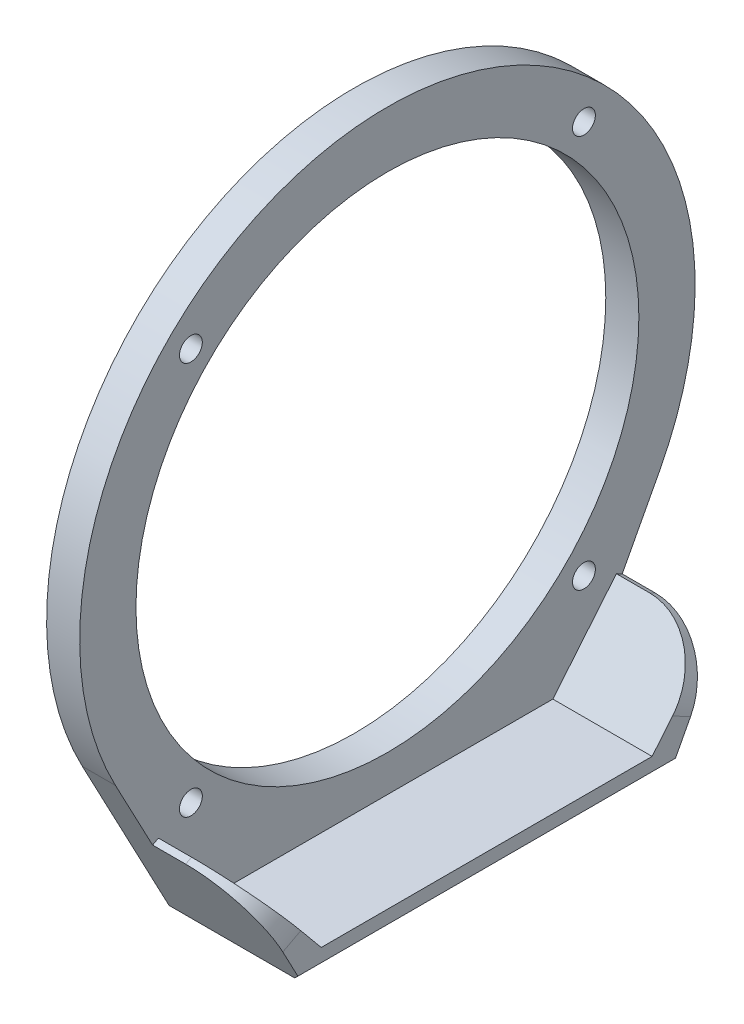
ISO-10303-21;
HEADER;
FILE_DESCRIPTION(('STEP AP214'),'2;1');
FILE_NAME('part.step','',(''),(''),'','','');
FILE_SCHEMA(('AUTOMOTIVE_DESIGN { 1 0 10303 214 1 1 1 1 }'));
ENDSEC;
DATA;
#1=APPLICATION_CONTEXT('core data for automotive mechanical design processes');
#2=APPLICATION_PROTOCOL_DEFINITION('international standard','automotive_design',2000,#1);
#3=PRODUCT_CONTEXT('',#1,'mechanical');
#4=PRODUCT('Part','Part','',(#3));
#5=PRODUCT_RELATED_PRODUCT_CATEGORY('part','',(#4));
#6=PRODUCT_DEFINITION_FORMATION('','',#4);
#7=PRODUCT_DEFINITION_CONTEXT('part definition',#1,'design');
#8=PRODUCT_DEFINITION('design','',#6,#7);
#9=PRODUCT_DEFINITION_SHAPE('','',#8);
#10=(LENGTH_UNIT() NAMED_UNIT(*) SI_UNIT(.MILLI.,.METRE.));
#11=(NAMED_UNIT(*) PLANE_ANGLE_UNIT() SI_UNIT($,.RADIAN.));
#12=(NAMED_UNIT(*) SI_UNIT($,.STERADIAN.) SOLID_ANGLE_UNIT());
#13=UNCERTAINTY_MEASURE_WITH_UNIT(LENGTH_MEASURE(1.E-05),#10,'distance_accuracy_value','');
#14=(GEOMETRIC_REPRESENTATION_CONTEXT(3) GLOBAL_UNCERTAINTY_ASSIGNED_CONTEXT((#13)) GLOBAL_UNIT_ASSIGNED_CONTEXT((#10,
#11,#12)) REPRESENTATION_CONTEXT('',''));
#15=CARTESIAN_POINT('',(0.,0.,0.));
#16=DIRECTION('',(0.,0.,1.));
#17=DIRECTION('',(1.,0.,0.));
#18=AXIS2_PLACEMENT_3D('',#15,#16,#17);
#19=CARTESIAN_POINT('',(5.,0.,0.));
#20=DIRECTION('',(1.,0.,0.));
#21=DIRECTION('',(0.,0.,-1.));
#22=AXIS2_PLACEMENT_3D('',#19,#20,#21);
#23=PLANE('',#22);
#24=CARTESIAN_POINT('',(5.,-29.698484809835,-29.698484809835));
#25=DIRECTION('',(1.,0.,0.));
#26=DIRECTION('',(0.,0.,-1.));
#27=AXIS2_PLACEMENT_3D('',#24,#25,#26);
#28=CIRCLE('',#27,1.7272);
#29=CARTESIAN_POINT('',(5.,-29.698484809835,-31.425684809835));
#30=VERTEX_POINT('',#29);
#31=EDGE_CURVE('E260',#30,#30,#28,.T.);
#32=ORIENTED_EDGE('',*,*,#31,.F.);
#33=EDGE_LOOP('',(#32));
#34=FACE_BOUND('',#33,.T.);
#35=CARTESIAN_POINT('',(5.,29.698484809835,-29.698484809835));
#36=DIRECTION('',(1.,0.,0.));
#37=DIRECTION('',(0.,0.,-1.));
#38=AXIS2_PLACEMENT_3D('',#35,#36,#37);
#39=CIRCLE('',#38,1.7272);
#40=CARTESIAN_POINT('',(5.,29.698484809835,-31.425684809835));
#41=VERTEX_POINT('',#40);
#42=EDGE_CURVE('E218',#41,#41,#39,.T.);
#43=ORIENTED_EDGE('',*,*,#42,.F.);
#44=EDGE_LOOP('',(#43));
#45=FACE_BOUND('',#44,.T.);
#46=CARTESIAN_POINT('',(5.,29.698484809835,29.698484809835));
#47=DIRECTION('',(1.,0.,0.));
#48=DIRECTION('',(0.,0.,-1.));
#49=AXIS2_PLACEMENT_3D('',#46,#47,#48);
#50=CIRCLE('',#49,1.7272);
#51=CARTESIAN_POINT('',(5.,29.698484809835,27.971284809835));
#52=VERTEX_POINT('',#51);
#53=EDGE_CURVE('E253',#52,#52,#50,.T.);
#54=ORIENTED_EDGE('',*,*,#53,.F.);
#55=EDGE_LOOP('',(#54));
#56=FACE_BOUND('',#55,.T.);
#57=CARTESIAN_POINT('',(5.,-29.698484809835,29.698484809835));
#58=DIRECTION('',(1.,0.,0.));
#59=DIRECTION('',(0.,0.,-1.));
#60=AXIS2_PLACEMENT_3D('',#57,#58,#59);
#61=CIRCLE('',#60,1.7272);
#62=CARTESIAN_POINT('',(5.,-29.698484809835,27.971284809835));
#63=VERTEX_POINT('',#62);
#64=EDGE_CURVE('E163',#63,#63,#61,.T.);
#65=ORIENTED_EDGE('',*,*,#64,.F.);
#66=EDGE_LOOP('',(#65));
#67=FACE_BOUND('',#66,.T.);
#68=DIRECTION('',(0.,-0.467798048366563,0.883835383962667));
#69=VECTOR('',#68,1.);
#70=CARTESIAN_POINT('',(5.,-32.3586338565974,35.4847687738651));
#71=LINE('',#70,#69);
#72=CARTESIAN_POINT('',(5.,-31.8908358082308,34.6009333899024));
#73=VERTEX_POINT('',#72);
#74=CARTESIAN_POINT('',(5.,-32.3586338565974,35.4847687738651));
#75=VERTEX_POINT('',#74);
#76=EDGE_CURVE('E170',#73,#75,#71,.T.);
#77=ORIENTED_EDGE('',*,*,#76,.F.);
#78=DIRECTION('',(0.,0.770611119642559,0.637305658442824));
#79=VECTOR('',#78,1.);
#80=CARTESIAN_POINT('',(5.,-31.8908358082308,34.6009333899024));
#81=LINE('',#80,#79);
#82=CARTESIAN_POINT('',(5.,-43.5,25.));
#83=VERTEX_POINT('',#82);
#84=EDGE_CURVE('E167',#83,#73,#81,.T.);
#85=ORIENTED_EDGE('',*,*,#84,.F.);
#86=DIRECTION('',(0.,0.,1.));
#87=VECTOR('',#86,1.);
#88=CARTESIAN_POINT('',(5.,-43.5,-25.));
#89=LINE('',#88,#87);
#90=CARTESIAN_POINT('',(5.,-43.5,-25.));
#91=VERTEX_POINT('',#90);
#92=EDGE_CURVE('E165',#91,#83,#89,.T.);
#93=ORIENTED_EDGE('',*,*,#92,.F.);
#94=DIRECTION('',(0.,-0.770611119642559,0.637305658442824));
#95=VECTOR('',#94,1.);
#96=CARTESIAN_POINT('',(5.,-31.8908358082308,-34.6009333899024));
#97=LINE('',#96,#95);
#98=CARTESIAN_POINT('',(5.,-31.8908358082308,-34.6009333899024));
#99=VERTEX_POINT('',#98);
#100=EDGE_CURVE('E145',#99,#91,#97,.T.);
#101=ORIENTED_EDGE('',*,*,#100,.F.);
#102=DIRECTION('',(0.,0.467798048366563,0.883835383962667));
#103=VECTOR('',#102,1.);
#104=CARTESIAN_POINT('',(5.,-32.3586338565974,-35.4847687738651));
#105=LINE('',#104,#103);
#106=CARTESIAN_POINT('',(5.,-32.3586338565974,-35.4847687738651));
#107=VERTEX_POINT('',#106);
#108=EDGE_CURVE('E160',#107,#99,#105,.T.);
#109=ORIENTED_EDGE('',*,*,#108,.F.);
#110=DIRECTION('',(0.,0.883835383962664,-0.467798048366568));
#111=VECTOR('',#110,1.);
#112=CARTESIAN_POINT('',(5.,-46.5,-28.));
#113=LINE('',#112,#111);
#114=CARTESIAN_POINT('',(5.,-21.7526092490454,-41.0983453542639));
#115=VERTEX_POINT('',#114);
#116=EDGE_CURVE('E191',#107,#115,#113,.T.);
#117=ORIENTED_EDGE('',*,*,#116,.T.);
#118=CARTESIAN_POINT('',(5.,0.,0.));
#119=DIRECTION('',(1.,0.,0.));
#120=DIRECTION('',(0.,0.,-1.));
#121=AXIS2_PLACEMENT_3D('',#118,#119,#120);
#122=CIRCLE('',#121,46.5);
#123=CARTESIAN_POINT('',(5.,-21.7526092490454,41.0983453542639));
#124=VERTEX_POINT('',#123);
#125=EDGE_CURVE('E194',#115,#124,#122,.T.);
#126=ORIENTED_EDGE('',*,*,#125,.T.);
#127=DIRECTION('',(0.,-0.883835383962664,-0.467798048366568));
#128=VECTOR('',#127,1.);
#129=CARTESIAN_POINT('',(5.,-46.5,28.));
#130=LINE('',#129,#128);
#131=EDGE_CURVE('E188',#124,#75,#130,.T.);
#132=ORIENTED_EDGE('',*,*,#131,.T.);
#133=EDGE_LOOP('',(#77,#85,#93,#101,#109,#117,#126,#132));
#134=FACE_BOUND('',#133,.T.);
#135=CARTESIAN_POINT('',(5.,0.,0.));
#136=DIRECTION('',(1.,0.,0.));
#137=DIRECTION('',(0.,0.,-1.));
#138=AXIS2_PLACEMENT_3D('',#135,#136,#137);
#139=CIRCLE('',#138,38.);
#140=CARTESIAN_POINT('',(5.,0.,-38.));
#141=VERTEX_POINT('',#140);
#142=EDGE_CURVE('E182',#141,#141,#139,.T.);
#143=ORIENTED_EDGE('',*,*,#142,.F.);
#144=EDGE_LOOP('',(#143));
#145=FACE_BOUND('',#144,.T.);
#146=ADVANCED_FACE('F34',(#34,#45,#56,#67,#134,#145),#23,.T.);
#147=CARTESIAN_POINT('',(0.,0.,0.));
#148=DIRECTION('',(1.,0.,0.));
#149=DIRECTION('',(0.,0.,-1.));
#150=AXIS2_PLACEMENT_3D('',#147,#148,#149);
#151=PLANE('',#150);
#152=CARTESIAN_POINT('',(0.,-29.698484809835,-29.698484809835));
#153=DIRECTION('',(-1.,0.,0.));
#154=DIRECTION('',(0.,0.,1.));
#155=AXIS2_PLACEMENT_3D('',#152,#153,#154);
#156=CIRCLE('',#155,1.7272);
#157=CARTESIAN_POINT('',(0.,-29.698484809835,-27.971284809835));
#158=VERTEX_POINT('',#157);
#159=EDGE_CURVE('E263',#158,#158,#156,.T.);
#160=ORIENTED_EDGE('',*,*,#159,.F.);
#161=EDGE_LOOP('',(#160));
#162=FACE_BOUND('',#161,.T.);
#163=CARTESIAN_POINT('',(0.,29.698484809835,-29.698484809835));
#164=DIRECTION('',(-1.,0.,0.));
#165=DIRECTION('',(0.,0.,1.));
#166=AXIS2_PLACEMENT_3D('',#163,#164,#165);
#167=CIRCLE('',#166,1.7272);
#168=CARTESIAN_POINT('',(0.,29.698484809835,-27.971284809835));
#169=VERTEX_POINT('',#168);
#170=EDGE_CURVE('E222',#169,#169,#167,.T.);
#171=ORIENTED_EDGE('',*,*,#170,.F.);
#172=EDGE_LOOP('',(#171));
#173=FACE_BOUND('',#172,.T.);
#174=CARTESIAN_POINT('',(0.,29.698484809835,29.698484809835));
#175=DIRECTION('',(-1.,0.,0.));
#176=DIRECTION('',(0.,0.,1.));
#177=AXIS2_PLACEMENT_3D('',#174,#175,#176);
#178=CIRCLE('',#177,1.7272);
#179=CARTESIAN_POINT('',(0.,29.698484809835,31.425684809835));
#180=VERTEX_POINT('',#179);
#181=EDGE_CURVE('E221',#180,#180,#178,.T.);
#182=ORIENTED_EDGE('',*,*,#181,.F.);
#183=EDGE_LOOP('',(#182));
#184=FACE_BOUND('',#183,.T.);
#185=CARTESIAN_POINT('',(0.,-29.698484809835,29.698484809835));
#186=DIRECTION('',(-1.,0.,0.));
#187=DIRECTION('',(0.,0.,1.));
#188=AXIS2_PLACEMENT_3D('',#185,#186,#187);
#189=CIRCLE('',#188,1.7272);
#190=CARTESIAN_POINT('',(0.,-29.698484809835,31.425684809835));
#191=VERTEX_POINT('',#190);
#192=EDGE_CURVE('E217',#191,#191,#189,.T.);
#193=ORIENTED_EDGE('',*,*,#192,.F.);
#194=EDGE_LOOP('',(#193));
#195=FACE_BOUND('',#194,.T.);
#196=DIRECTION('',(0.,-0.883835383962664,-0.467798048366568));
#197=VECTOR('',#196,1.);
#198=CARTESIAN_POINT('',(0.,-46.5,28.));
#199=LINE('',#198,#197);
#200=CARTESIAN_POINT('',(0.,-21.7526092490454,41.0983453542639));
#201=VERTEX_POINT('',#200);
#202=CARTESIAN_POINT('',(0.,-46.5,28.));
#203=VERTEX_POINT('',#202);
#204=EDGE_CURVE('E185',#201,#203,#199,.T.);
#205=ORIENTED_EDGE('',*,*,#204,.F.);
#206=CARTESIAN_POINT('',(0.,0.,0.));
#207=DIRECTION('',(1.,0.,0.));
#208=DIRECTION('',(0.,0.,-1.));
#209=AXIS2_PLACEMENT_3D('',#206,#207,#208);
#210=CIRCLE('',#209,46.5);
#211=CARTESIAN_POINT('',(0.,-21.7526092490454,-41.0983453542639));
#212=VERTEX_POINT('',#211);
#213=EDGE_CURVE('E192',#212,#201,#210,.T.);
#214=ORIENTED_EDGE('',*,*,#213,.F.);
#215=DIRECTION('',(0.,0.883835383962664,-0.467798048366568));
#216=VECTOR('',#215,1.);
#217=CARTESIAN_POINT('',(0.,-46.5,-28.));
#218=LINE('',#217,#216);
#219=CARTESIAN_POINT('',(0.,-46.5,-28.));
#220=VERTEX_POINT('',#219);
#221=EDGE_CURVE('E202',#220,#212,#218,.T.);
#222=ORIENTED_EDGE('',*,*,#221,.F.);
#223=DIRECTION('',(0.,0.,-1.));
#224=VECTOR('',#223,1.);
#225=CARTESIAN_POINT('',(0.,-46.5,28.));
#226=LINE('',#225,#224);
#227=EDGE_CURVE('E199',#203,#220,#226,.T.);
#228=ORIENTED_EDGE('',*,*,#227,.F.);
#229=EDGE_LOOP('',(#205,#214,#222,#228));
#230=FACE_BOUND('',#229,.T.);
#231=CARTESIAN_POINT('',(0.,0.,0.));
#232=DIRECTION('',(1.,0.,0.));
#233=DIRECTION('',(0.,0.,-1.));
#234=AXIS2_PLACEMENT_3D('',#231,#232,#233);
#235=CIRCLE('',#234,38.);
#236=CARTESIAN_POINT('',(0.,0.,-38.));
#237=VERTEX_POINT('',#236);
#238=EDGE_CURVE('E181',#237,#237,#235,.T.);
#239=ORIENTED_EDGE('',*,*,#238,.T.);
#240=EDGE_LOOP('',(#239));
#241=FACE_BOUND('',#240,.T.);
#242=ADVANCED_FACE('F269',(#162,#173,#184,#195,#230,#241),#151,.F.);
#243=CARTESIAN_POINT('',(5.,-46.5,28.));
#244=DIRECTION('',(0.,0.467798048366568,-0.883835383962664));
#245=DIRECTION('',(0.,0.883835383962664,0.467798048366568));
#246=AXIS2_PLACEMENT_3D('',#243,#244,#245);
#247=PLANE('',#246);
#248=DIRECTION('',(-1.,0.,0.));
#249=VECTOR('',#248,1.);
#250=CARTESIAN_POINT('',(5.,-46.5,28.));
#251=LINE('',#250,#249);
#252=CARTESIAN_POINT('',(19.,-46.5,28.));
#253=VERTEX_POINT('',#252);
#254=EDGE_CURVE('E212',#253,#203,#251,.T.);
#255=ORIENTED_EDGE('',*,*,#254,.F.);
#256=DIRECTION('',(0.662245948072001,0.662245948071992,0.3505147764709));
#257=VECTOR('',#256,1.);
#258=CARTESIAN_POINT('',(13.3775836586735,-52.1224163413264,25.02415694223));
#259=LINE('',#258,#257);
#260=CARTESIAN_POINT('',(20.,-45.5,28.5292818740399));
#261=VERTEX_POINT('',#260);
#262=EDGE_CURVE('E11',#253,#261,#259,.T.);
#263=ORIENTED_EDGE('',*,*,#262,.T.);
#264=DIRECTION('',(0.,-0.883835383962665,-0.467798048366567));
#265=VECTOR('',#264,1.);
#266=CARTESIAN_POINT('',(20.,-32.3586338565974,35.4847687738651));
#267=LINE('',#266,#265);
#268=CARTESIAN_POINT('',(20.,-41.196987696224,30.8067882901994));
#269=VERTEX_POINT('',#268);
#270=EDGE_CURVE('E173',#269,#261,#267,.T.);
#271=ORIENTED_EDGE('',*,*,#270,.F.);
#272=CARTESIAN_POINT('',(10.,-41.196987696224,30.8067882901994));
#273=DIRECTION('',(0.,0.467798048366568,-0.883835383962664));
#274=DIRECTION('',(0.,0.883835383962664,0.467798048366568));
#275=AXIS2_PLACEMENT_3D('',#272,#273,#274);
#276=CIRCLE('',#275,10.);
#277=CARTESIAN_POINT('',(10.,-32.3586338565974,35.4847687738651));
#278=VERTEX_POINT('',#277);
#279=EDGE_CURVE('E233',#269,#278,#276,.F.);
#280=ORIENTED_EDGE('',*,*,#279,.T.);
#281=DIRECTION('',(-1.,0.,0.));
#282=VECTOR('',#281,1.);
#283=CARTESIAN_POINT('',(20.,-32.3586338565974,35.4847687738651));
#284=LINE('',#283,#282);
#285=EDGE_CURVE('E156',#278,#75,#284,.T.);
#286=ORIENTED_EDGE('',*,*,#285,.T.);
#287=ORIENTED_EDGE('',*,*,#131,.F.);
#288=DIRECTION('',(-1.,0.,0.));
#289=VECTOR('',#288,1.);
#290=CARTESIAN_POINT('',(5.,-21.7526092490454,41.0983453542639));
#291=LINE('',#290,#289);
#292=EDGE_CURVE('E196',#124,#201,#291,.T.);
#293=ORIENTED_EDGE('',*,*,#292,.T.);
#294=ORIENTED_EDGE('',*,*,#204,.T.);
#295=EDGE_LOOP('',(#255,#263,#271,#280,#286,#287,#293,#294));
#296=FACE_BOUND('',#295,.T.);
#297=ADVANCED_FACE('F272',(#296),#247,.F.);
#298=CARTESIAN_POINT('',(5.,-46.5,28.));
#299=DIRECTION('',(0.,1.,0.));
#300=DIRECTION('',(0.,0.,1.));
#301=AXIS2_PLACEMENT_3D('',#298,#299,#300);
#302=PLANE('',#301);
#303=DIRECTION('',(-1.,0.,0.));
#304=VECTOR('',#303,1.);
#305=CARTESIAN_POINT('',(5.,-46.5,-28.));
#306=LINE('',#305,#304);
#307=CARTESIAN_POINT('',(19.,-46.5,-28.));
#308=VERTEX_POINT('',#307);
#309=EDGE_CURVE('E210',#308,#220,#306,.T.);
#310=ORIENTED_EDGE('',*,*,#309,.F.);
#311=DIRECTION('',(0.,0.,1.));
#312=VECTOR('',#311,1.);
#313=CARTESIAN_POINT('',(19.,-46.5,28.));
#314=LINE('',#313,#312);
#315=EDGE_CURVE('E42',#308,#253,#314,.T.);
#316=ORIENTED_EDGE('',*,*,#315,.T.);
#317=ORIENTED_EDGE('',*,*,#254,.T.);
#318=ORIENTED_EDGE('',*,*,#227,.T.);
#319=EDGE_LOOP('',(#310,#316,#317,#318));
#320=FACE_BOUND('',#319,.T.);
#321=ADVANCED_FACE('F310',(#320),#302,.F.);
#322=CARTESIAN_POINT('',(5.,-46.5,-28.));
#323=DIRECTION('',(0.,0.467798048366568,0.883835383962664));
#324=DIRECTION('',(0.,-0.883835383962664,0.467798048366568));
#325=AXIS2_PLACEMENT_3D('',#322,#323,#324);
#326=PLANE('',#325);
#327=DIRECTION('',(0.,0.883835383962664,-0.467798048366568));
#328=VECTOR('',#327,1.);
#329=CARTESIAN_POINT('',(20.,-46.5,-28.));
#330=LINE('',#329,#328);
#331=CARTESIAN_POINT('',(20.,-45.5,-28.5292818740399));
#332=VERTEX_POINT('',#331);
#333=CARTESIAN_POINT('',(20.,-41.196987696224,-30.8067882901994));
#334=VERTEX_POINT('',#333);
#335=EDGE_CURVE('E138',#332,#334,#330,.T.);
#336=ORIENTED_EDGE('',*,*,#335,.F.);
#337=DIRECTION('',(-0.662245948072001,-0.662245948071992,0.3505147764709));
#338=VECTOR('',#337,1.);
#339=CARTESIAN_POINT('',(13.3775836586735,-52.1224163413264,-25.02415694223));
#340=LINE('',#339,#338);
#341=EDGE_CURVE('E56',#332,#308,#340,.T.);
#342=ORIENTED_EDGE('',*,*,#341,.T.);
#343=ORIENTED_EDGE('',*,*,#309,.T.);
#344=ORIENTED_EDGE('',*,*,#221,.T.);
#345=DIRECTION('',(-1.,0.,0.));
#346=VECTOR('',#345,1.);
#347=CARTESIAN_POINT('',(5.,-21.7526092490454,-41.0983453542639));
#348=LINE('',#347,#346);
#349=EDGE_CURVE('E207',#115,#212,#348,.T.);
#350=ORIENTED_EDGE('',*,*,#349,.F.);
#351=ORIENTED_EDGE('',*,*,#116,.F.);
#352=DIRECTION('',(-1.,0.,0.));
#353=VECTOR('',#352,1.);
#354=CARTESIAN_POINT('',(20.,-32.3586338565974,-35.4847687738651));
#355=LINE('',#354,#353);
#356=CARTESIAN_POINT('',(10.,-32.3586338565974,-35.4847687738651));
#357=VERTEX_POINT('',#356);
#358=EDGE_CURVE('E179',#357,#107,#355,.T.);
#359=ORIENTED_EDGE('',*,*,#358,.F.);
#360=CARTESIAN_POINT('',(10.,-41.196987696224,-30.8067882901994));
#361=DIRECTION('',(0.,0.467798048366568,0.883835383962664));
#362=DIRECTION('',(0.,-0.883835383962664,0.467798048366568));
#363=AXIS2_PLACEMENT_3D('',#360,#361,#362);
#364=CIRCLE('',#363,10.);
#365=EDGE_CURVE('E230',#357,#334,#364,.F.);
#366=ORIENTED_EDGE('',*,*,#365,.T.);
#367=EDGE_LOOP('',(#336,#342,#343,#344,#350,#351,#359,#366));
#368=FACE_BOUND('',#367,.T.);
#369=ADVANCED_FACE('F246',(#368),#326,.F.);
#370=CARTESIAN_POINT('',(5.,0.,0.));
#371=DIRECTION('',(-1.,0.,0.));
#372=DIRECTION('',(0.,0.,1.));
#373=AXIS2_PLACEMENT_3D('',#370,#371,#372);
#374=CYLINDRICAL_SURFACE('',#373,46.5);
#375=ORIENTED_EDGE('',*,*,#213,.T.);
#376=ORIENTED_EDGE('',*,*,#292,.F.);
#377=ORIENTED_EDGE('',*,*,#125,.F.);
#378=ORIENTED_EDGE('',*,*,#349,.T.);
#379=EDGE_LOOP('',(#375,#376,#377,#378));
#380=FACE_BOUND('',#379,.T.);
#381=ADVANCED_FACE('F289',(#380),#374,.T.);
#382=CARTESIAN_POINT('',(5.,0.,0.));
#383=DIRECTION('',(-1.,0.,0.));
#384=DIRECTION('',(0.,0.,1.));
#385=AXIS2_PLACEMENT_3D('',#382,#383,#384);
#386=CYLINDRICAL_SURFACE('',#385,38.);
#387=ORIENTED_EDGE('',*,*,#142,.T.);
#388=EDGE_LOOP('',(#387));
#389=FACE_BOUND('',#388,.T.);
#390=ORIENTED_EDGE('',*,*,#238,.F.);
#391=EDGE_LOOP('',(#390));
#392=FACE_BOUND('',#391,.T.);
#393=ADVANCED_FACE('F286',(#389,#392),#386,.F.);
#394=CARTESIAN_POINT('',(20.,-32.3586338565974,-35.4847687738651));
#395=DIRECTION('',(0.,-0.883835383962667,0.467798048366563));
#396=DIRECTION('',(0.,-0.467798048366563,-0.883835383962667));
#397=AXIS2_PLACEMENT_3D('',#394,#395,#396);
#398=PLANE('',#397);
#399=DIRECTION('',(-1.,0.,0.));
#400=VECTOR('',#399,1.);
#401=CARTESIAN_POINT('',(20.,-31.8908358082308,-34.6009333899024));
#402=LINE('',#401,#400);
#403=CARTESIAN_POINT('',(10.,-31.8908358082308,-34.6009333899024));
#404=VERTEX_POINT('',#403);
#405=EDGE_CURVE('E148',#404,#99,#402,.T.);
#406=ORIENTED_EDGE('',*,*,#405,.F.);
#407=DIRECTION('',(0.,0.467798048366563,0.883835383962667));
#408=VECTOR('',#407,1.);
#409=CARTESIAN_POINT('',(10.,-32.3586338565974,-35.4847687738651));
#410=LINE('',#409,#408);
#411=EDGE_CURVE('E228',#404,#357,#410,.F.);
#412=ORIENTED_EDGE('',*,*,#411,.T.);
#413=ORIENTED_EDGE('',*,*,#358,.T.);
#414=ORIENTED_EDGE('',*,*,#108,.T.);
#415=EDGE_LOOP('',(#406,#412,#413,#414));
#416=FACE_BOUND('',#415,.T.);
#417=ADVANCED_FACE('F288',(#416),#398,.F.);
#418=CARTESIAN_POINT('',(20.,-31.8908358082308,-34.6009333899024));
#419=DIRECTION('',(0.,-0.637305658442824,-0.770611119642559));
#420=DIRECTION('',(0.,0.770611119642559,-0.637305658442824));
#421=AXIS2_PLACEMENT_3D('',#418,#419,#420);
#422=PLANE('',#421);
#423=DIRECTION('',(0.,-0.770611119642559,0.637305658442824));
#424=VECTOR('',#423,1.);
#425=CARTESIAN_POINT('',(20.,-31.8908358082308,-34.6009333899024));
#426=LINE('',#425,#424);
#427=CARTESIAN_POINT('',(20.,-39.7604482924846,-28.0926590630363));
#428=VERTEX_POINT('',#427);
#429=CARTESIAN_POINT('',(20.,-43.5,-25.));
#430=VERTEX_POINT('',#429);
#431=EDGE_CURVE('E127',#428,#430,#426,.T.);
#432=ORIENTED_EDGE('',*,*,#431,.F.);
#433=CARTESIAN_POINT('',(10.,-39.7604482924846,-28.0926590630363));
#434=DIRECTION('',(0.,-0.637305658442824,-0.770611119642559));
#435=DIRECTION('',(0.,0.770611119642559,-0.637305658442824));
#436=AXIS2_PLACEMENT_3D('',#433,#434,#435);
#437=ELLIPSE('',#436,10.2121709428538,10.);
#438=EDGE_CURVE('E226',#428,#404,#437,.F.);
#439=ORIENTED_EDGE('',*,*,#438,.T.);
#440=ORIENTED_EDGE('',*,*,#405,.T.);
#441=ORIENTED_EDGE('',*,*,#100,.T.);
#442=DIRECTION('',(-1.,0.,0.));
#443=VECTOR('',#442,1.);
#444=CARTESIAN_POINT('',(20.,-43.5,-25.));
#445=LINE('',#444,#443);
#446=EDGE_CURVE('E142',#430,#91,#445,.T.);
#447=ORIENTED_EDGE('',*,*,#446,.F.);
#448=EDGE_LOOP('',(#432,#439,#440,#441,#447));
#449=FACE_BOUND('',#448,.T.);
#450=ADVANCED_FACE('F143',(#449),#422,.F.);
#451=CARTESIAN_POINT('',(20.,-43.5,-25.));
#452=DIRECTION('',(0.,-1.,0.));
#453=DIRECTION('',(0.,0.,-1.));
#454=AXIS2_PLACEMENT_3D('',#451,#452,#453);
#455=PLANE('',#454);
#456=ORIENTED_EDGE('',*,*,#92,.T.);
#457=DIRECTION('',(-1.,0.,0.));
#458=VECTOR('',#457,1.);
#459=CARTESIAN_POINT('',(20.,-43.5,25.));
#460=LINE('',#459,#458);
#461=CARTESIAN_POINT('',(20.,-43.5,25.));
#462=VERTEX_POINT('',#461);
#463=EDGE_CURVE('E149',#462,#83,#460,.T.);
#464=ORIENTED_EDGE('',*,*,#463,.F.);
#465=DIRECTION('',(0.,0.,1.));
#466=VECTOR('',#465,1.);
#467=CARTESIAN_POINT('',(20.,-43.5,-25.));
#468=LINE('',#467,#466);
#469=EDGE_CURVE('E133',#430,#462,#468,.T.);
#470=ORIENTED_EDGE('',*,*,#469,.F.);
#471=ORIENTED_EDGE('',*,*,#446,.T.);
#472=EDGE_LOOP('',(#456,#464,#470,#471));
#473=FACE_BOUND('',#472,.T.);
#474=ADVANCED_FACE('F151',(#473),#455,.F.);
#475=CARTESIAN_POINT('',(20.,-31.8908358082308,34.6009333899024));
#476=DIRECTION('',(0.,-0.637305658442824,0.770611119642559));
#477=DIRECTION('',(0.,-0.770611119642559,-0.637305658442824));
#478=AXIS2_PLACEMENT_3D('',#475,#476,#477);
#479=PLANE('',#478);
#480=DIRECTION('',(-1.,0.,0.));
#481=VECTOR('',#480,1.);
#482=CARTESIAN_POINT('',(20.,-31.8908358082308,34.6009333899024));
#483=LINE('',#482,#481);
#484=CARTESIAN_POINT('',(10.,-31.8908358082308,34.6009333899024));
#485=VERTEX_POINT('',#484);
#486=EDGE_CURVE('E175',#485,#73,#483,.T.);
#487=ORIENTED_EDGE('',*,*,#486,.F.);
#488=CARTESIAN_POINT('',(10.,-39.7604482924846,28.0926590630363));
#489=DIRECTION('',(0.,-0.637305658442824,0.770611119642559));
#490=DIRECTION('',(0.,-0.770611119642559,-0.637305658442824));
#491=AXIS2_PLACEMENT_3D('',#488,#489,#490);
#492=ELLIPSE('',#491,10.2121709428538,10.);
#493=CARTESIAN_POINT('',(20.,-39.7604482924846,28.0926590630363));
#494=VERTEX_POINT('',#493);
#495=EDGE_CURVE('E237',#485,#494,#492,.F.);
#496=ORIENTED_EDGE('',*,*,#495,.T.);
#497=DIRECTION('',(0.,0.770611119642559,0.637305658442824));
#498=VECTOR('',#497,1.);
#499=CARTESIAN_POINT('',(20.,-31.8908358082308,34.6009333899024));
#500=LINE('',#499,#498);
#501=EDGE_CURVE('E154',#462,#494,#500,.T.);
#502=ORIENTED_EDGE('',*,*,#501,.F.);
#503=ORIENTED_EDGE('',*,*,#463,.T.);
#504=ORIENTED_EDGE('',*,*,#84,.T.);
#505=EDGE_LOOP('',(#487,#496,#502,#503,#504));
#506=FACE_BOUND('',#505,.T.);
#507=ADVANCED_FACE('F330',(#506),#479,.F.);
#508=CARTESIAN_POINT('',(20.,-32.3586338565974,35.4847687738651));
#509=DIRECTION('',(0.,-0.883835383962667,-0.467798048366563));
#510=DIRECTION('',(0.,0.467798048366563,-0.883835383962667));
#511=AXIS2_PLACEMENT_3D('',#508,#509,#510);
#512=PLANE('',#511);
#513=ORIENTED_EDGE('',*,*,#285,.F.);
#514=DIRECTION('',(0.,-0.467798048366563,0.883835383962667));
#515=VECTOR('',#514,1.);
#516=CARTESIAN_POINT('',(10.,-31.8908358082308,34.6009333899024));
#517=LINE('',#516,#515);
#518=EDGE_CURVE('E235',#278,#485,#517,.F.);
#519=ORIENTED_EDGE('',*,*,#518,.T.);
#520=ORIENTED_EDGE('',*,*,#486,.T.);
#521=ORIENTED_EDGE('',*,*,#76,.T.);
#522=EDGE_LOOP('',(#513,#519,#520,#521));
#523=FACE_BOUND('',#522,.T.);
#524=ADVANCED_FACE('F345',(#523),#512,.F.);
#525=CARTESIAN_POINT('',(20.,0.,0.));
#526=DIRECTION('',(1.,0.,0.));
#527=DIRECTION('',(0.,0.,-1.));
#528=AXIS2_PLACEMENT_3D('',#525,#526,#527);
#529=PLANE('',#528);
#530=ORIENTED_EDGE('',*,*,#270,.T.);
#531=DIRECTION('',(0.,0.,-1.));
#532=VECTOR('',#531,1.);
#533=CARTESIAN_POINT('',(20.,-45.5,-28.));
#534=LINE('',#533,#532);
#535=EDGE_CURVE('E239',#261,#332,#534,.T.);
#536=ORIENTED_EDGE('',*,*,#535,.T.);
#537=ORIENTED_EDGE('',*,*,#335,.T.);
#538=DIRECTION('',(0.,0.467798048366563,0.883835383962667));
#539=VECTOR('',#538,1.);
#540=CARTESIAN_POINT('',(20.,-40.7291896478575,-29.9229529062368));
#541=LINE('',#540,#539);
#542=EDGE_CURVE('E136',#334,#428,#541,.T.);
#543=ORIENTED_EDGE('',*,*,#542,.T.);
#544=ORIENTED_EDGE('',*,*,#431,.T.);
#545=ORIENTED_EDGE('',*,*,#469,.T.);
#546=ORIENTED_EDGE('',*,*,#501,.T.);
#547=DIRECTION('',(0.,-0.467798048366563,0.883835383962667));
#548=VECTOR('',#547,1.);
#549=CARTESIAN_POINT('',(20.,-41.196987696224,30.8067882901994));
#550=LINE('',#549,#548);
#551=EDGE_CURVE('E214',#494,#269,#550,.T.);
#552=ORIENTED_EDGE('',*,*,#551,.T.);
#553=EDGE_LOOP('',(#530,#536,#537,#543,#544,#545,#546,#552));
#554=FACE_BOUND('',#553,.T.);
#555=ADVANCED_FACE('F130',(#554),#529,.T.);
#556=CARTESIAN_POINT('',(0.,-29.698484809835,29.698484809835));
#557=DIRECTION('',(-1.,0.,0.));
#558=DIRECTION('',(0.,0.,1.));
#559=AXIS2_PLACEMENT_3D('',#556,#557,#558);
#560=CYLINDRICAL_SURFACE('',#559,1.7272);
#561=ORIENTED_EDGE('',*,*,#64,.T.);
#562=EDGE_LOOP('',(#561));
#563=FACE_BOUND('',#562,.T.);
#564=ORIENTED_EDGE('',*,*,#192,.T.);
#565=EDGE_LOOP('',(#564));
#566=FACE_BOUND('',#565,.T.);
#567=ADVANCED_FACE('F352',(#563,#566),#560,.F.);
#568=CARTESIAN_POINT('',(0.,29.698484809835,29.698484809835));
#569=DIRECTION('',(-1.,0.,0.));
#570=DIRECTION('',(0.,0.,1.));
#571=AXIS2_PLACEMENT_3D('',#568,#569,#570);
#572=CYLINDRICAL_SURFACE('',#571,1.7272);
#573=ORIENTED_EDGE('',*,*,#53,.T.);
#574=EDGE_LOOP('',(#573));
#575=FACE_BOUND('',#574,.T.);
#576=ORIENTED_EDGE('',*,*,#181,.T.);
#577=EDGE_LOOP('',(#576));
#578=FACE_BOUND('',#577,.T.);
#579=ADVANCED_FACE('F432',(#575,#578),#572,.F.);
#580=CARTESIAN_POINT('',(0.,29.698484809835,-29.698484809835));
#581=DIRECTION('',(-1.,0.,0.));
#582=DIRECTION('',(0.,0.,1.));
#583=AXIS2_PLACEMENT_3D('',#580,#581,#582);
#584=CYLINDRICAL_SURFACE('',#583,1.7272);
#585=ORIENTED_EDGE('',*,*,#42,.T.);
#586=EDGE_LOOP('',(#585));
#587=FACE_BOUND('',#586,.T.);
#588=ORIENTED_EDGE('',*,*,#170,.T.);
#589=EDGE_LOOP('',(#588));
#590=FACE_BOUND('',#589,.T.);
#591=ADVANCED_FACE('F439',(#587,#590),#584,.F.);
#592=CARTESIAN_POINT('',(0.,-29.698484809835,-29.698484809835));
#593=DIRECTION('',(-1.,0.,0.));
#594=DIRECTION('',(0.,0.,1.));
#595=AXIS2_PLACEMENT_3D('',#592,#593,#594);
#596=CYLINDRICAL_SURFACE('',#595,1.7272);
#597=ORIENTED_EDGE('',*,*,#31,.T.);
#598=EDGE_LOOP('',(#597));
#599=FACE_BOUND('',#598,.T.);
#600=ORIENTED_EDGE('',*,*,#159,.T.);
#601=EDGE_LOOP('',(#600));
#602=FACE_BOUND('',#601,.T.);
#603=ADVANCED_FACE('F267',(#599,#602),#596,.F.);
#604=CARTESIAN_POINT('',(10.,-19.4443784471789,10.2915570640645));
#605=DIRECTION('',(0.,-0.467798048366563,-0.883835383962667));
#606=DIRECTION('',(0.,0.883835383962667,-0.467798048366563));
#607=AXIS2_PLACEMENT_3D('',#604,#605,#606);
#608=CYLINDRICAL_SURFACE('',#607,10.);
#609=ORIENTED_EDGE('',*,*,#365,.F.);
#610=ORIENTED_EDGE('',*,*,#411,.F.);
#611=ORIENTED_EDGE('',*,*,#438,.F.);
#612=ORIENTED_EDGE('',*,*,#542,.F.);
#613=EDGE_LOOP('',(#609,#610,#611,#612));
#614=FACE_BOUND('',#613,.T.);
#615=ADVANCED_FACE('F316',(#614),#608,.T.);
#616=CARTESIAN_POINT('',(10.,-19.4443784471789,-10.2915570640645));
#617=DIRECTION('',(0.,0.467798048366563,-0.883835383962667));
#618=DIRECTION('',(0.,0.883835383962667,0.467798048366563));
#619=AXIS2_PLACEMENT_3D('',#616,#617,#618);
#620=CYLINDRICAL_SURFACE('',#619,10.);
#621=ORIENTED_EDGE('',*,*,#495,.F.);
#622=ORIENTED_EDGE('',*,*,#518,.F.);
#623=ORIENTED_EDGE('',*,*,#279,.F.);
#624=ORIENTED_EDGE('',*,*,#551,.F.);
#625=EDGE_LOOP('',(#621,#622,#623,#624));
#626=FACE_BOUND('',#625,.T.);
#627=ADVANCED_FACE('F318',(#626),#620,.T.);
#628=CARTESIAN_POINT('',(20.,-45.5,0.));
#629=DIRECTION('',(0.707106781186542,-0.707106781186552,0.));
#630=DIRECTION('',(0.,0.,1.));
#631=AXIS2_PLACEMENT_3D('',#628,#629,#630);
#632=PLANE('',#631);
#633=ORIENTED_EDGE('',*,*,#262,.F.);
#634=ORIENTED_EDGE('',*,*,#315,.F.);
#635=ORIENTED_EDGE('',*,*,#341,.F.);
#636=ORIENTED_EDGE('',*,*,#535,.F.);
#637=EDGE_LOOP('',(#633,#634,#635,#636));
#638=FACE_BOUND('',#637,.T.);
#639=ADVANCED_FACE('F36',(#638),#632,.T.);
#640=CLOSED_SHELL('',(#146,#242,#297,#321,#369,#381,#393,#417,#450,#474,#507,#524,#555,#567,
#579,#591,#603,#615,#627,#639));
#641=MANIFOLD_SOLID_BREP('B2',#640);
#642=ADVANCED_BREP_SHAPE_REPRESENTATION('',(#18,#641),#14);
#643=SHAPE_DEFINITION_REPRESENTATION(#9,#642);
ENDSEC;
END-ISO-10303-21;
